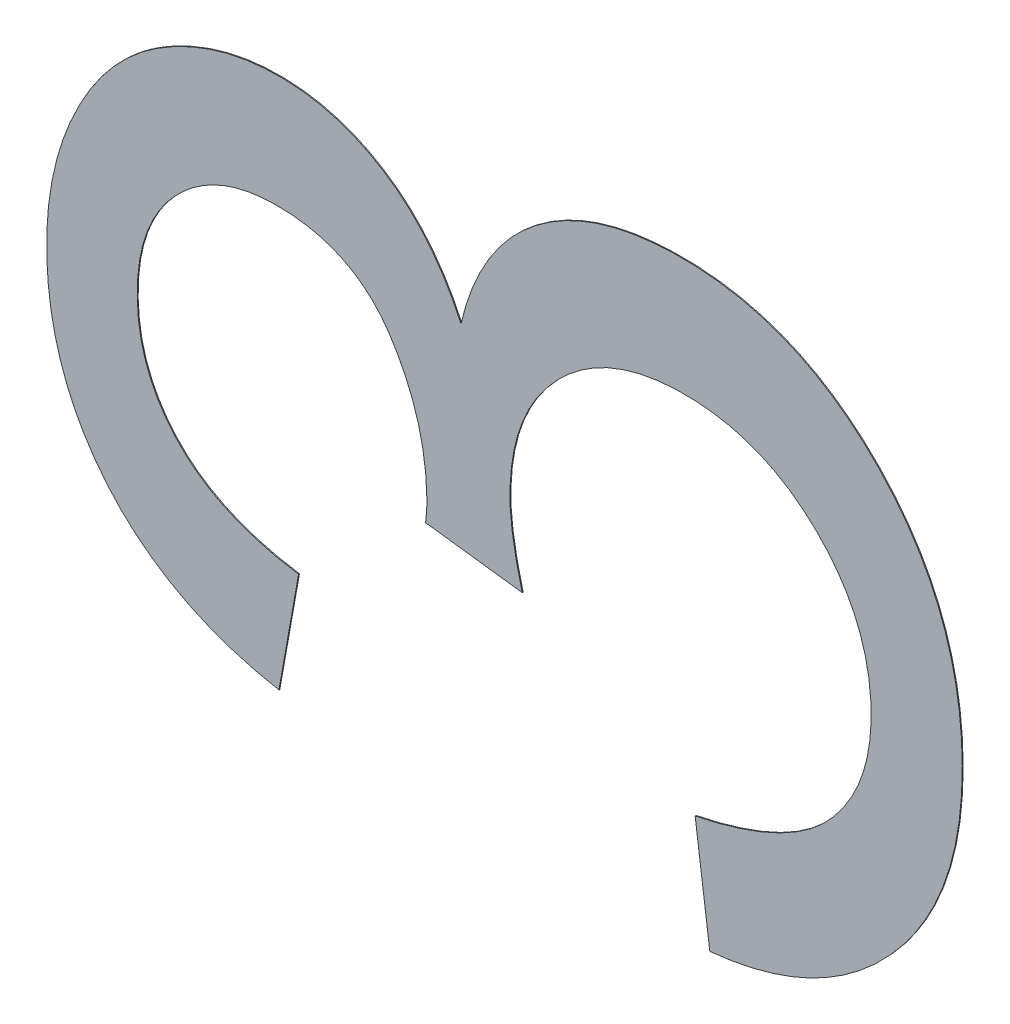
ISO-10303-21;
HEADER;
FILE_DESCRIPTION(('STEP AP214'),'2;1');
FILE_NAME('part.step','',(''),(''),'','','');
FILE_SCHEMA(('AUTOMOTIVE_DESIGN { 1 0 10303 214 1 1 1 1 }'));
ENDSEC;
DATA;
#1=APPLICATION_CONTEXT('core data for automotive mechanical design processes');
#2=APPLICATION_PROTOCOL_DEFINITION('international standard','automotive_design',2000,#1);
#3=PRODUCT_CONTEXT('',#1,'mechanical');
#4=PRODUCT('Part','Part','',(#3));
#5=PRODUCT_RELATED_PRODUCT_CATEGORY('part','',(#4));
#6=PRODUCT_DEFINITION_FORMATION('','',#4);
#7=PRODUCT_DEFINITION_CONTEXT('part definition',#1,'design');
#8=PRODUCT_DEFINITION('design','',#6,#7);
#9=PRODUCT_DEFINITION_SHAPE('','',#8);
#10=(LENGTH_UNIT() NAMED_UNIT(*) SI_UNIT(.MILLI.,.METRE.));
#11=(NAMED_UNIT(*) PLANE_ANGLE_UNIT() SI_UNIT($,.RADIAN.));
#12=(NAMED_UNIT(*) SI_UNIT($,.STERADIAN.) SOLID_ANGLE_UNIT());
#13=UNCERTAINTY_MEASURE_WITH_UNIT(LENGTH_MEASURE(1.E-05),#10,'distance_accuracy_value','');
#14=(GEOMETRIC_REPRESENTATION_CONTEXT(3) GLOBAL_UNCERTAINTY_ASSIGNED_CONTEXT((#13)) GLOBAL_UNIT_ASSIGNED_CONTEXT((#10,
#11,#12)) REPRESENTATION_CONTEXT('',''));
#15=CARTESIAN_POINT('',(0.,0.,0.));
#16=DIRECTION('',(0.,0.,1.));
#17=DIRECTION('',(1.,0.,0.));
#18=AXIS2_PLACEMENT_3D('',#15,#16,#17);
#19=CARTESIAN_POINT('',(76.139328831594,-11.4827296910171,0.002));
#20=DIRECTION('',(0.99122790068264,0.132163720090978,0.));
#21=DIRECTION('',(-0.132163720090978,0.99122790068264,0.));
#22=AXIS2_PLACEMENT_3D('',#19,#20,#21);
#23=PLANE('',#22);
#24=CARTESIAN_POINT('',(76.139328831594,-11.4827296910171,0.));
#25=CARTESIAN_POINT('',(76.1502421390082,-11.5645794966238,0.));
#26=CARTESIAN_POINT('',(76.1611554464225,-11.6464293022305,0.));
#27=CARTESIAN_POINT('',(76.1720687538367,-11.7282791078372,0.));
#28=B_SPLINE_CURVE_WITH_KNOTS('',3,(#24,#25,#26,#27),.UNSPECIFIED.,.F.,.F.,(4,4),(0.,
0.0232044426593577),.UNSPECIFIED.);
#29=CARTESIAN_POINT('',(76.139328831594,-11.4827296910171,0.));
#30=VERTEX_POINT('',#29);
#31=CARTESIAN_POINT('',(76.1720687538367,-11.7282791078372,0.));
#32=VERTEX_POINT('',#31);
#33=EDGE_CURVE('E84',#30,#32,#28,.T.);
#34=ORIENTED_EDGE('',*,*,#33,.T.);
#35=DIRECTION('',(0.,0.,-1.));
#36=VECTOR('',#35,1.);
#37=CARTESIAN_POINT('',(76.1720687538367,-11.7282791078372,0.002));
#38=LINE('',#37,#36);
#39=CARTESIAN_POINT('',(76.1720687538367,-11.7282791078372,0.002));
#40=VERTEX_POINT('',#39);
#41=EDGE_CURVE('E93',#40,#32,#38,.T.);
#42=ORIENTED_EDGE('',*,*,#41,.F.);
#43=CARTESIAN_POINT('',(76.139328831594,-11.4827296910171,0.002));
#44=CARTESIAN_POINT('',(76.1502421390082,-11.5645794966238,0.002));
#45=CARTESIAN_POINT('',(76.1611554464225,-11.6464293022305,0.002));
#46=CARTESIAN_POINT('',(76.1720687538367,-11.7282791078372,0.002));
#47=B_SPLINE_CURVE_WITH_KNOTS('',3,(#43,#44,#45,#46),.UNSPECIFIED.,.F.,.F.,(4,4),(0.,
0.0232044426593577),.UNSPECIFIED.);
#48=CARTESIAN_POINT('',(76.139328831594,-11.4827296910171,0.002));
#49=VERTEX_POINT('',#48);
#50=EDGE_CURVE('E98',#49,#40,#47,.T.);
#51=ORIENTED_EDGE('',*,*,#50,.F.);
#52=DIRECTION('',(0.,0.,-1.));
#53=VECTOR('',#52,1.);
#54=CARTESIAN_POINT('',(76.139328831594,-11.4827296910171,0.002));
#55=LINE('',#54,#53);
#56=EDGE_CURVE('E90',#49,#30,#55,.T.);
#57=ORIENTED_EDGE('',*,*,#56,.T.);
#58=EDGE_LOOP('',(#34,#42,#51,#57));
#59=FACE_BOUND('',#58,.T.);
#60=ADVANCED_FACE('F17',(#59),#23,.F.);
#61=CARTESIAN_POINT('',(76.1720687538367,-11.7282791078372,0.002));
#62=CARTESIAN_POINT('',(76.3386331082464,-11.7119091467159,0.002));
#63=CARTESIAN_POINT('',(76.4740945365255,-11.6460200532025,0.002));
#64=CARTESIAN_POINT('',(76.6827914811104,-11.4135889462921,0.002));
#65=CARTESIAN_POINT('',(76.7356046654389,-11.2682832003275,0.002));
#66=CARTESIAN_POINT('',(76.7356046654389,-10.8979128299571,0.002));
#67=CARTESIAN_POINT('',(76.6746265602619,-10.7370779619399,0.002));
#68=CARTESIAN_POINT('',(76.4321564460913,-10.4823205109026,0.002));
#69=CARTESIAN_POINT('',(76.2837937384899,-10.4186822181298,0.002));
#70=CARTESIAN_POINT('',(75.980130959689,-10.4186822181298,0.002));
#71=CARTESIAN_POINT('',(75.8724984653161,-10.4514221403725,0.002));
#72=CARTESIAN_POINT('',(75.700613873542,-10.5823818293432,0.002));
#73=CARTESIAN_POINT('',(75.6441375076734,-10.6744628606508,0.002));
#74=CARTESIAN_POINT('',(75.6167178227952,-10.7927358297525,0.002));
#75=B_SPLINE_CURVE_WITH_KNOTS('',3,(#61,#62,#63,#64,#65,#66,#67,#68,#69,#70,#71,#72,#73,#74),
.UNSPECIFIED.,.F.,.F.,(4,2,2,2,2,2,4),(0.0232044426593577,0.066610375503474,0.110007964892098,
0.158160068735886,0.206389561465785,0.242165429312379,0.277941297158973),.UNSPECIFIED.);
#76=DIRECTION('',(0.,0.,-1.));
#77=VECTOR('',#76,1.);
#78=SURFACE_OF_LINEAR_EXTRUSION('',#75,#77);
#79=CARTESIAN_POINT('',(76.1720687538367,-11.7282791078372,0.));
#80=CARTESIAN_POINT('',(76.3386331082464,-11.7119091467159,0.));
#81=CARTESIAN_POINT('',(76.4740945365255,-11.6460200532025,0.));
#82=CARTESIAN_POINT('',(76.6827914811104,-11.4135889462921,0.));
#83=CARTESIAN_POINT('',(76.7356046654389,-11.2682832003275,0.));
#84=CARTESIAN_POINT('',(76.7356046654389,-10.8979128299571,0.));
#85=CARTESIAN_POINT('',(76.6746265602619,-10.7370779619399,0.));
#86=CARTESIAN_POINT('',(76.4321564460913,-10.4823205109026,0.));
#87=CARTESIAN_POINT('',(76.2837937384899,-10.4186822181298,0.));
#88=CARTESIAN_POINT('',(75.980130959689,-10.4186822181298,0.));
#89=CARTESIAN_POINT('',(75.8724984653161,-10.4514221403725,0.));
#90=CARTESIAN_POINT('',(75.700613873542,-10.5823818293432,0.));
#91=CARTESIAN_POINT('',(75.6441375076734,-10.6744628606508,0.));
#92=CARTESIAN_POINT('',(75.6167178227952,-10.7927358297525,0.));
#93=B_SPLINE_CURVE_WITH_KNOTS('',3,(#79,#80,#81,#82,#83,#84,#85,#86,#87,#88,#89,#90,#91,#92),
.UNSPECIFIED.,.F.,.F.,(4,2,2,2,2,2,4),(0.0232044426593577,0.066610375503474,0.110007964892098,
0.158160068735886,0.206389561465785,0.242165429312379,0.277941297158973),.UNSPECIFIED.);
#94=CARTESIAN_POINT('',(75.6167178227952,-10.7927358297525,0.));
#95=VERTEX_POINT('',#94);
#96=EDGE_CURVE('E81',#32,#95,#93,.T.);
#97=ORIENTED_EDGE('',*,*,#96,.T.);
#98=DIRECTION('',(0.,0.,-1.));
#99=VECTOR('',#98,1.);
#100=CARTESIAN_POINT('',(75.6167178227952,-10.7927358297525,0.002));
#101=LINE('',#100,#99);
#102=CARTESIAN_POINT('',(75.6167178227952,-10.7927358297525,0.002));
#103=VERTEX_POINT('',#102);
#104=EDGE_CURVE('E89',#103,#95,#101,.T.);
#105=ORIENTED_EDGE('',*,*,#104,.F.);
#106=EDGE_CURVE('E75',#40,#103,#75,.T.);
#107=ORIENTED_EDGE('',*,*,#106,.F.);
#108=ORIENTED_EDGE('',*,*,#41,.T.);
#109=EDGE_LOOP('',(#97,#105,#107,#108));
#110=FACE_BOUND('',#109,.T.);
#111=ADVANCED_FACE('F94',(#110),#78,.F.);
#112=CARTESIAN_POINT('',(75.6167178227952,-10.7927358297525,0.002));
#113=CARTESIAN_POINT('',(75.5749744219357,-10.701473296501,0.002));
#114=CARTESIAN_POINT('',(75.5184980560671,-10.6327194597914,0.002));
#115=CARTESIAN_POINT('',(75.3768978923675,-10.5402291794558,0.002));
#116=CARTESIAN_POINT('',(75.297912829957,-10.5169019848579,0.002));
#117=CARTESIAN_POINT('',(75.1207080008185,-10.5169019848579,0.002));
#118=CARTESIAN_POINT('',(75.0347657049315,-10.5414569265399,0.002));
#119=CARTESIAN_POINT('',(74.8725225536707,-10.6381472894125,0.002));
#120=CARTESIAN_POINT('',(74.8088602414569,-10.7088397790056,0.002));
#121=CARTESIAN_POINT('',(74.7156321978395,-10.8928424966716,0.002));
#122=CARTESIAN_POINT('',(74.6918150194393,-10.9932678534889,0.002));
#123=CARTESIAN_POINT('',(74.6918150194393,-11.2605074687948,0.002));
#124=CARTESIAN_POINT('',(74.7372416615511,-11.3926949048497,0.002));
#125=CARTESIAN_POINT('',(74.9181297319419,-11.6055043994271,0.002));
#126=CARTESIAN_POINT('',(75.0458154286884,-11.6738489871087,0.002));
#127=CARTESIAN_POINT('',(75.2103335379578,-11.7037241661552,0.002));
#128=B_SPLINE_CURVE_WITH_KNOTS('',3,(#112,#113,#114,#115,#116,#117,#118,#119,#120,#121,#122,
#123,#124,#125,#126,#127),.UNSPECIFIED.,.F.,.F.,(4,2,2,2,2,2,2,4),(0.277941297158973,
0.303950140793694,0.329958984428419,0.357323739342681,0.384749462392673,0.412127725608855,
0.451960010814352,0.491792296019848),.UNSPECIFIED.);
#129=DIRECTION('',(0.,0.,-1.));
#130=VECTOR('',#129,1.);
#131=SURFACE_OF_LINEAR_EXTRUSION('',#128,#130);
#132=CARTESIAN_POINT('',(75.6167178227952,-10.7927358297525,0.));
#133=CARTESIAN_POINT('',(75.5749744219357,-10.701473296501,0.));
#134=CARTESIAN_POINT('',(75.5184980560671,-10.6327194597914,0.));
#135=CARTESIAN_POINT('',(75.3768978923675,-10.5402291794558,0.));
#136=CARTESIAN_POINT('',(75.297912829957,-10.5169019848579,0.));
#137=CARTESIAN_POINT('',(75.1207080008185,-10.5169019848579,0.));
#138=CARTESIAN_POINT('',(75.0347657049315,-10.5414569265399,0.));
#139=CARTESIAN_POINT('',(74.8725225536707,-10.6381472894125,0.));
#140=CARTESIAN_POINT('',(74.8088602414569,-10.7088397790056,0.));
#141=CARTESIAN_POINT('',(74.7156321978395,-10.8928424966716,0.));
#142=CARTESIAN_POINT('',(74.6918150194393,-10.9932678534889,0.));
#143=CARTESIAN_POINT('',(74.6918150194393,-11.2605074687948,0.));
#144=CARTESIAN_POINT('',(74.7372416615511,-11.3926949048497,0.));
#145=CARTESIAN_POINT('',(74.9181297319419,-11.6055043994271,0.));
#146=CARTESIAN_POINT('',(75.0458154286884,-11.6738489871087,0.));
#147=CARTESIAN_POINT('',(75.2103335379578,-11.7037241661552,0.));
#148=B_SPLINE_CURVE_WITH_KNOTS('',3,(#132,#133,#134,#135,#136,#137,#138,#139,#140,#141,#142,
#143,#144,#145,#146,#147),.UNSPECIFIED.,.F.,.F.,(4,2,2,2,2,2,2,4),(0.277941297158973,
0.303950140793694,0.329958984428419,0.357323739342681,0.384749462392673,0.412127725608855,
0.451960010814352,0.491792296019848),.UNSPECIFIED.);
#149=CARTESIAN_POINT('',(75.2103335379578,-11.7037241661552,0.));
#150=VERTEX_POINT('',#149);
#151=EDGE_CURVE('E86',#95,#150,#148,.T.);
#152=ORIENTED_EDGE('',*,*,#151,.T.);
#153=DIRECTION('',(0.,0.,-1.));
#154=VECTOR('',#153,1.);
#155=CARTESIAN_POINT('',(75.2103335379578,-11.7037241661552,0.002));
#156=LINE('',#155,#154);
#157=CARTESIAN_POINT('',(75.2103335379578,-11.7037241661552,0.002));
#158=VERTEX_POINT('',#157);
#159=EDGE_CURVE('E226',#158,#150,#156,.T.);
#160=ORIENTED_EDGE('',*,*,#159,.F.);
#161=EDGE_CURVE('E216',#103,#158,#128,.T.);
#162=ORIENTED_EDGE('',*,*,#161,.F.);
#163=ORIENTED_EDGE('',*,*,#104,.T.);
#164=EDGE_LOOP('',(#152,#160,#162,#163));
#165=FACE_BOUND('',#164,.T.);
#166=ADVANCED_FACE('F150',(#165),#131,.F.);
#167=CARTESIAN_POINT('',(75.2103335379578,-11.7037241661552,0.002));
#168=DIRECTION('',(-0.98446811246998,0.175563480057198,0.));
#169=DIRECTION('',(-0.175563480057198,-0.98446811246998,0.));
#170=AXIS2_PLACEMENT_3D('',#167,#168,#169);
#171=PLANE('',#170);
#172=CARTESIAN_POINT('',(75.2103335379578,-11.7037241661552,0.));
#173=CARTESIAN_POINT('',(75.2249300866244,-11.6218743605485,0.));
#174=CARTESIAN_POINT('',(75.2395266352909,-11.5400245549418,0.));
#175=CARTESIAN_POINT('',(75.2541231839574,-11.4581747493351,0.));
#176=B_SPLINE_CURVE_WITH_KNOTS('',3,(#172,#173,#174,#175),.UNSPECIFIED.,.F.,.F.,(4,4),
(0.491792296019848,0.515597741763177),.UNSPECIFIED.);
#177=CARTESIAN_POINT('',(75.2541231839574,-11.4581747493351,0.));
#178=VERTEX_POINT('',#177);
#179=EDGE_CURVE('E213',#150,#178,#176,.T.);
#180=ORIENTED_EDGE('',*,*,#179,.T.);
#181=DIRECTION('',(0.,0.,-1.));
#182=VECTOR('',#181,1.);
#183=CARTESIAN_POINT('',(75.2541231839574,-11.4581747493351,0.002));
#184=LINE('',#183,#182);
#185=CARTESIAN_POINT('',(75.2541231839574,-11.4581747493351,0.002));
#186=VERTEX_POINT('',#185);
#187=EDGE_CURVE('E202',#186,#178,#184,.T.);
#188=ORIENTED_EDGE('',*,*,#187,.F.);
#189=CARTESIAN_POINT('',(75.2103335379578,-11.7037241661552,0.002));
#190=CARTESIAN_POINT('',(75.2249300866244,-11.6218743605485,0.002));
#191=CARTESIAN_POINT('',(75.2395266352909,-11.5400245549418,0.002));
#192=CARTESIAN_POINT('',(75.2541231839574,-11.4581747493351,0.002));
#193=B_SPLINE_CURVE_WITH_KNOTS('',3,(#189,#190,#191,#192),.UNSPECIFIED.,.F.,.F.,(4,4),
(0.491792296019848,0.515597741763177),.UNSPECIFIED.);
#194=EDGE_CURVE('E192',#158,#186,#193,.T.);
#195=ORIENTED_EDGE('',*,*,#194,.F.);
#196=ORIENTED_EDGE('',*,*,#159,.T.);
#197=EDGE_LOOP('',(#180,#188,#195,#196));
#198=FACE_BOUND('',#197,.T.);
#199=ADVANCED_FACE('F153',(#198),#171,.F.);
#200=CARTESIAN_POINT('',(75.2541231839574,-11.4581747493351,0.002));
#201=CARTESIAN_POINT('',(75.1338039697156,-11.4401677921016,0.002));
#202=CARTESIAN_POINT('',(75.0437691835482,-11.3992428892982,0.002));
#203=CARTESIAN_POINT('',(74.9242802479249,-11.2715697800021,0.002));
#204=CARTESIAN_POINT('',(74.8939840392879,-11.1921628811132,0.002));
#205=CARTESIAN_POINT('',(74.8939840392879,-11.0002250869655,0.002));
#206=CARTESIAN_POINT('',(74.9234499693063,-10.9216492735831,0.002));
#207=CARTESIAN_POINT('',(75.0415116858055,-10.7994881919276,0.002));
#208=CARTESIAN_POINT('',(75.1162062615101,-10.7694086351546,0.002));
#209=CARTESIAN_POINT('',(75.3200122774708,-10.7694086351546,0.002));
#210=CARTESIAN_POINT('',(75.4039083282177,-10.811152036014,0.002));
#211=CARTESIAN_POINT('',(75.5132771657816,-10.9784700337796,0.002));
#212=CARTESIAN_POINT('',(75.5405975035809,-11.0726621649274,0.002));
#213=CARTESIAN_POINT('',(75.5405975035809,-11.1872518927768,0.002));
#214=CARTESIAN_POINT('',(75.5393697564968,-11.2003478616739,0.002));
#215=CARTESIAN_POINT('',(75.5377327603847,-11.2167178227953,0.002));
#216=B_SPLINE_CURVE_WITH_KNOTS('',3,(#200,#201,#202,#203,#204,#205,#206,#207,#208,#209,#210,
#211,#212,#213,#214,#215),.UNSPECIFIED.,.F.,.F.,(4,2,2,2,2,2,2,4),(0.515597741763177,
0.544454297632026,0.573305164054458,0.602527500860012,0.631848017465603,0.668898488449028,
0.705739584065372,0.709193436779405),.UNSPECIFIED.);
#217=DIRECTION('',(0.,0.,-1.));
#218=VECTOR('',#217,1.);
#219=SURFACE_OF_LINEAR_EXTRUSION('',#216,#218);
#220=CARTESIAN_POINT('',(75.2541231839574,-11.4581747493351,0.));
#221=CARTESIAN_POINT('',(75.1338039697156,-11.4401677921016,0.));
#222=CARTESIAN_POINT('',(75.0437691835482,-11.3992428892982,0.));
#223=CARTESIAN_POINT('',(74.9242802479249,-11.2715697800021,0.));
#224=CARTESIAN_POINT('',(74.8939840392879,-11.1921628811132,0.));
#225=CARTESIAN_POINT('',(74.8939840392879,-11.0002250869655,0.));
#226=CARTESIAN_POINT('',(74.9234499693063,-10.9216492735831,0.));
#227=CARTESIAN_POINT('',(75.0415116858055,-10.7994881919276,0.));
#228=CARTESIAN_POINT('',(75.1162062615101,-10.7694086351546,0.));
#229=CARTESIAN_POINT('',(75.3200122774708,-10.7694086351546,0.));
#230=CARTESIAN_POINT('',(75.4039083282177,-10.811152036014,0.));
#231=CARTESIAN_POINT('',(75.5132771657816,-10.9784700337796,0.));
#232=CARTESIAN_POINT('',(75.5405975035809,-11.0726621649274,0.));
#233=CARTESIAN_POINT('',(75.5405975035809,-11.1872518927768,0.));
#234=CARTESIAN_POINT('',(75.5393697564968,-11.2003478616739,0.));
#235=CARTESIAN_POINT('',(75.5377327603847,-11.2167178227953,0.));
#236=B_SPLINE_CURVE_WITH_KNOTS('',3,(#220,#221,#222,#223,#224,#225,#226,#227,#228,#229,#230,
#231,#232,#233,#234,#235),.UNSPECIFIED.,.F.,.F.,(4,2,2,2,2,2,2,4),(0.515597741763177,
0.544454297632026,0.573305164054458,0.602527500860012,0.631848017465603,0.668898488449028,
0.705739584065372,0.709193436779405),.UNSPECIFIED.);
#237=CARTESIAN_POINT('',(75.5377327603847,-11.2167178227953,0.));
#238=VERTEX_POINT('',#237);
#239=EDGE_CURVE('E189',#178,#238,#236,.T.);
#240=ORIENTED_EDGE('',*,*,#239,.T.);
#241=DIRECTION('',(0.,0.,-1.));
#242=VECTOR('',#241,1.);
#243=CARTESIAN_POINT('',(75.5377327603847,-11.2167178227953,0.002));
#244=LINE('',#243,#242);
#245=CARTESIAN_POINT('',(75.5377327603847,-11.2167178227953,0.002));
#246=VERTEX_POINT('',#245);
#247=EDGE_CURVE('E181',#246,#238,#244,.T.);
#248=ORIENTED_EDGE('',*,*,#247,.F.);
#249=EDGE_CURVE('E176',#186,#246,#216,.T.);
#250=ORIENTED_EDGE('',*,*,#249,.F.);
#251=ORIENTED_EDGE('',*,*,#187,.T.);
#252=EDGE_LOOP('',(#240,#248,#250,#251));
#253=FACE_BOUND('',#252,.T.);
#254=ADVANCED_FACE('F157',(#253),#219,.F.);
#255=CARTESIAN_POINT('',(75.5377327603847,-11.2167178227953,0.002));
#256=DIRECTION('',(0.126119560250323,0.992015048536193,0.));
#257=DIRECTION('',(-0.992015048536193,0.126119560250323,0.));
#258=AXIS2_PLACEMENT_3D('',#255,#256,#257);
#259=PLANE('',#258);
#260=CARTESIAN_POINT('',(75.5377327603847,-11.2167178227953,0.));
#261=CARTESIAN_POINT('',(75.6096241729759,-11.2258577177547,0.));
#262=CARTESIAN_POINT('',(75.6815155855671,-11.2349976127141,0.));
#263=CARTESIAN_POINT('',(75.7534069981584,-11.2441375076735,0.));
#264=B_SPLINE_CURVE_WITH_KNOTS('',3,(#260,#261,#262,#263),.UNSPECIFIED.,.F.,.F.,(4,4),
(0.709193436779405,0.730889641076664),.UNSPECIFIED.);
#265=CARTESIAN_POINT('',(75.7534069981584,-11.2441375076735,0.));
#266=VERTEX_POINT('',#265);
#267=EDGE_CURVE('E180',#238,#266,#264,.T.);
#268=ORIENTED_EDGE('',*,*,#267,.T.);
#269=DIRECTION('',(0.,0.,-1.));
#270=VECTOR('',#269,1.);
#271=CARTESIAN_POINT('',(75.7534069981584,-11.2441375076735,0.002));
#272=LINE('',#271,#270);
#273=CARTESIAN_POINT('',(75.7534069981584,-11.2441375076735,0.002));
#274=VERTEX_POINT('',#273);
#275=EDGE_CURVE('E242',#274,#266,#272,.T.);
#276=ORIENTED_EDGE('',*,*,#275,.F.);
#277=CARTESIAN_POINT('',(75.5377327603847,-11.2167178227953,0.002));
#278=CARTESIAN_POINT('',(75.6096241729759,-11.2258577177547,0.002));
#279=CARTESIAN_POINT('',(75.6815155855671,-11.2349976127141,0.002));
#280=CARTESIAN_POINT('',(75.7534069981584,-11.2441375076735,0.002));
#281=B_SPLINE_CURVE_WITH_KNOTS('',3,(#277,#278,#279,#280),.UNSPECIFIED.,.F.,.F.,(4,4),
(0.709193436779405,0.730889641076664),.UNSPECIFIED.);
#282=EDGE_CURVE('E38',#246,#274,#281,.T.);
#283=ORIENTED_EDGE('',*,*,#282,.F.);
#284=ORIENTED_EDGE('',*,*,#247,.T.);
#285=EDGE_LOOP('',(#268,#276,#283,#284));
#286=FACE_BOUND('',#285,.T.);
#287=ADVANCED_FACE('F161',(#286),#259,.F.);
#288=CARTESIAN_POINT('',(75.7534069981584,-11.2441375076735,0.002));
#289=CARTESIAN_POINT('',(75.7349907918969,-11.1749744219358,0.002));
#290=CARTESIAN_POINT('',(75.7259873132801,-11.1172703089831,0.002));
#291=CARTESIAN_POINT('',(75.7259873132801,-10.957253939022,0.002));
#292=CARTESIAN_POINT('',(75.7624104767751,-10.8635359116023,0.002));
#293=CARTESIAN_POINT('',(75.9089216288111,-10.7162062615102,0.002));
#294=CARTESIAN_POINT('',(76.0018211581747,-10.6793738489872,0.002));
#295=CARTESIAN_POINT('',(76.2330468590137,-10.6793738489872,0.002));
#296=CARTESIAN_POINT('',(76.3320851237978,-10.7190710047065,0.002));
#297=CARTESIAN_POINT('',(76.4921004497769,-10.8782699259611,0.002));
#298=CARTESIAN_POINT('',(76.5322078985062,-10.9756701452835,0.002));
#299=CARTESIAN_POINT('',(76.5322078985062,-11.1884796398609,0.002));
#300=CARTESIAN_POINT('',(76.5015142214037,-11.2711479435237,0.002));
#301=CARTESIAN_POINT('',(76.3789428144604,-11.4067936338743,0.002));
#302=CARTESIAN_POINT('',(76.2784735011254,-11.4544915080828,0.002));
#303=CARTESIAN_POINT('',(76.139328831594,-11.4827296910171,0.002));
#304=B_SPLINE_CURVE_WITH_KNOTS('',3,(#288,#289,#290,#291,#292,#293,#294,#295,#296,#297,#298,
#299,#300,#301,#302,#303),.UNSPECIFIED.,.F.,.F.,(4,2,2,2,2,2,2,4),(0.730889641076664,
0.748427231710672,0.791572808668675,0.834718385626673,0.879896181789213,0.924842890995769,
0.962483774677584,1.),.UNSPECIFIED.);
#305=DIRECTION('',(0.,0.,-1.));
#306=VECTOR('',#305,1.);
#307=SURFACE_OF_LINEAR_EXTRUSION('',#304,#306);
#308=CARTESIAN_POINT('',(75.7534069981584,-11.2441375076735,0.));
#309=CARTESIAN_POINT('',(75.7349907918969,-11.1749744219358,0.));
#310=CARTESIAN_POINT('',(75.7259873132801,-11.1172703089831,0.));
#311=CARTESIAN_POINT('',(75.7259873132801,-10.957253939022,0.));
#312=CARTESIAN_POINT('',(75.7624104767751,-10.8635359116023,0.));
#313=CARTESIAN_POINT('',(75.9089216288111,-10.7162062615102,0.));
#314=CARTESIAN_POINT('',(76.0018211581747,-10.6793738489872,0.));
#315=CARTESIAN_POINT('',(76.2330468590137,-10.6793738489872,0.));
#316=CARTESIAN_POINT('',(76.3320851237978,-10.7190710047065,0.));
#317=CARTESIAN_POINT('',(76.4921004497769,-10.8782699259611,0.));
#318=CARTESIAN_POINT('',(76.5322078985062,-10.9756701452835,0.));
#319=CARTESIAN_POINT('',(76.5322078985062,-11.1884796398609,0.));
#320=CARTESIAN_POINT('',(76.5015142214037,-11.2711479435237,0.));
#321=CARTESIAN_POINT('',(76.3789428144604,-11.4067936338743,0.));
#322=CARTESIAN_POINT('',(76.2784735011254,-11.4544915080828,0.));
#323=CARTESIAN_POINT('',(76.139328831594,-11.4827296910171,0.));
#324=B_SPLINE_CURVE_WITH_KNOTS('',3,(#308,#309,#310,#311,#312,#313,#314,#315,#316,#317,#318,
#319,#320,#321,#322,#323),.UNSPECIFIED.,.F.,.F.,(4,2,2,2,2,2,2,4),(0.730889641076664,
0.748427231710672,0.791572808668675,0.834718385626673,0.879896181789213,0.924842890995769,
0.962483774677584,1.),.UNSPECIFIED.);
#325=EDGE_CURVE('E30',#266,#30,#324,.T.);
#326=ORIENTED_EDGE('',*,*,#325,.T.);
#327=ORIENTED_EDGE('',*,*,#56,.F.);
#328=EDGE_CURVE('E11',#274,#49,#304,.T.);
#329=ORIENTED_EDGE('',*,*,#328,.F.);
#330=ORIENTED_EDGE('',*,*,#275,.T.);
#331=EDGE_LOOP('',(#326,#327,#329,#330));
#332=FACE_BOUND('',#331,.T.);
#333=ADVANCED_FACE('F272',(#332),#307,.F.);
#334=CARTESIAN_POINT('',(76.6062668548057,-10.672466460034,0.002));
#335=DIRECTION('',(0.,0.,-1.));
#336=DIRECTION('',(-1.,0.,0.));
#337=AXIS2_PLACEMENT_3D('',#334,#335,#336);
#338=PLANE('',#337);
#339=ORIENTED_EDGE('',*,*,#50,.T.);
#340=ORIENTED_EDGE('',*,*,#106,.T.);
#341=ORIENTED_EDGE('',*,*,#161,.T.);
#342=ORIENTED_EDGE('',*,*,#194,.T.);
#343=ORIENTED_EDGE('',*,*,#249,.T.);
#344=ORIENTED_EDGE('',*,*,#282,.T.);
#345=ORIENTED_EDGE('',*,*,#328,.T.);
#346=EDGE_LOOP('',(#339,#340,#341,#342,#343,#344,#345));
#347=FACE_BOUND('',#346,.T.);
#348=ADVANCED_FACE('F338',(#347),#338,.F.);
#349=CARTESIAN_POINT('',(76.6062668548057,-10.672466460034,0.));
#350=DIRECTION('',(0.,0.,-1.));
#351=DIRECTION('',(-1.,0.,0.));
#352=AXIS2_PLACEMENT_3D('',#349,#350,#351);
#353=PLANE('',#352);
#354=ORIENTED_EDGE('',*,*,#33,.F.);
#355=ORIENTED_EDGE('',*,*,#325,.F.);
#356=ORIENTED_EDGE('',*,*,#267,.F.);
#357=ORIENTED_EDGE('',*,*,#239,.F.);
#358=ORIENTED_EDGE('',*,*,#179,.F.);
#359=ORIENTED_EDGE('',*,*,#151,.F.);
#360=ORIENTED_EDGE('',*,*,#96,.F.);
#361=EDGE_LOOP('',(#354,#355,#356,#357,#358,#359,#360));
#362=FACE_BOUND('',#361,.T.);
#363=ADVANCED_FACE('F19',(#362),#353,.T.);
#364=CLOSED_SHELL('',(#60,#111,#166,#199,#254,#287,#333,#348,#363));
#365=MANIFOLD_SOLID_BREP('B1',#364);
#366=ADVANCED_BREP_SHAPE_REPRESENTATION('',(#18,#365),#14);
#367=SHAPE_DEFINITION_REPRESENTATION(#9,#366);
ENDSEC;
END-ISO-10303-21;
